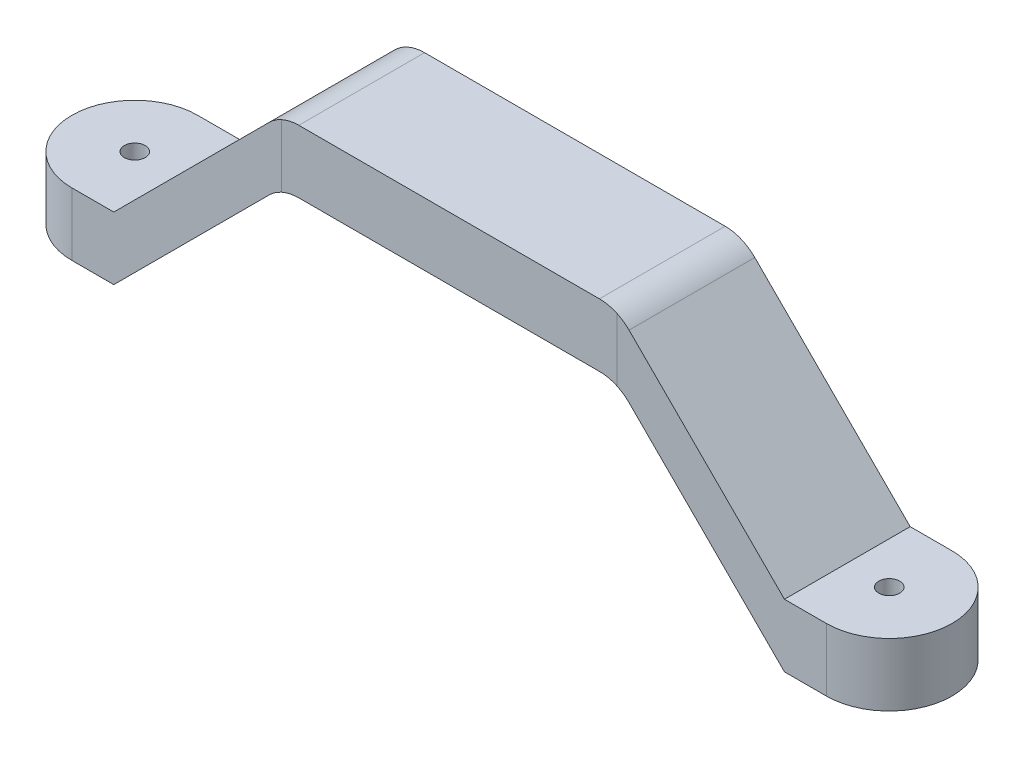
ISO-10303-21;
HEADER;
FILE_DESCRIPTION(('STEP AP214'),'2;1');
FILE_NAME('part.step','',(''),(''),'','','');
FILE_SCHEMA(('AUTOMOTIVE_DESIGN { 1 0 10303 214 1 1 1 1 }'));
ENDSEC;
DATA;
#1=APPLICATION_CONTEXT('core data for automotive mechanical design processes');
#2=APPLICATION_PROTOCOL_DEFINITION('international standard','automotive_design',2000,#1);
#3=PRODUCT_CONTEXT('',#1,'mechanical');
#4=PRODUCT('Part','Part','',(#3));
#5=PRODUCT_RELATED_PRODUCT_CATEGORY('part','',(#4));
#6=PRODUCT_DEFINITION_FORMATION('','',#4);
#7=PRODUCT_DEFINITION_CONTEXT('part definition',#1,'design');
#8=PRODUCT_DEFINITION('design','',#6,#7);
#9=PRODUCT_DEFINITION_SHAPE('','',#8);
#10=(LENGTH_UNIT() NAMED_UNIT(*) SI_UNIT(.MILLI.,.METRE.));
#11=(NAMED_UNIT(*) PLANE_ANGLE_UNIT() SI_UNIT($,.RADIAN.));
#12=(NAMED_UNIT(*) SI_UNIT($,.STERADIAN.) SOLID_ANGLE_UNIT());
#13=UNCERTAINTY_MEASURE_WITH_UNIT(LENGTH_MEASURE(1.E-05),#10,'distance_accuracy_value','');
#14=(GEOMETRIC_REPRESENTATION_CONTEXT(3) GLOBAL_UNCERTAINTY_ASSIGNED_CONTEXT((#13)) GLOBAL_UNIT_ASSIGNED_CONTEXT((#10,
#11,#12)) REPRESENTATION_CONTEXT('',''));
#15=CARTESIAN_POINT('',(0.,0.,0.));
#16=DIRECTION('',(0.,0.,1.));
#17=DIRECTION('',(1.,0.,0.));
#18=AXIS2_PLACEMENT_3D('',#15,#16,#17);
#19=CARTESIAN_POINT('',(50.8,41.275,-19.05));
#20=DIRECTION('',(0.,0.,-1.));
#21=DIRECTION('',(-1.,0.,0.));
#22=AXIS2_PLACEMENT_3D('',#19,#20,#21);
#23=PLANE('',#22);
#24=DIRECTION('',(1.,0.,0.));
#25=VECTOR('',#24,1.);
#26=CARTESIAN_POINT('',(50.8,60.325,-19.05));
#27=LINE('',#26,#25);
#28=CARTESIAN_POINT('',(56.0605122421383,60.325,-19.05));
#29=VERTEX_POINT('',#28);
#30=CARTESIAN_POINT('',(147.139487757862,60.325,-19.05));
#31=VERTEX_POINT('',#30);
#32=EDGE_CURVE('E300',#29,#31,#27,.T.);
#33=ORIENTED_EDGE('',*,*,#32,.T.);
#34=CARTESIAN_POINT('',(147.139487757862,47.625,-19.05));
#35=DIRECTION('',(0.,0.,-1.));
#36=DIRECTION('',(-1.,0.,0.));
#37=AXIS2_PLACEMENT_3D('',#34,#35,#36);
#38=CIRCLE('',#37,12.7);
#39=CARTESIAN_POINT('',(152.4,59.1842824582806,-19.05));
#40=VERTEX_POINT('',#39);
#41=EDGE_CURVE('E335',#31,#40,#38,.T.);
#42=ORIENTED_EDGE('',*,*,#41,.T.);
#43=DIRECTION('',(0.,1.,0.));
#44=VECTOR('',#43,1.);
#45=CARTESIAN_POINT('',(152.4,41.275,-19.05));
#46=LINE('',#45,#44);
#47=CARTESIAN_POINT('',(152.4,40.1342824582806,-19.05));
#48=VERTEX_POINT('',#47);
#49=EDGE_CURVE('E214',#48,#40,#46,.T.);
#50=ORIENTED_EDGE('',*,*,#49,.F.);
#51=CARTESIAN_POINT('',(147.139487757862,28.575,-19.05));
#52=DIRECTION('',(0.,0.,-1.));
#53=DIRECTION('',(-1.,0.,0.));
#54=AXIS2_PLACEMENT_3D('',#51,#52,#53);
#55=CIRCLE('',#54,12.7);
#56=CARTESIAN_POINT('',(147.139487757862,41.275,-19.05));
#57=VERTEX_POINT('',#56);
#58=EDGE_CURVE('E367',#48,#57,#55,.F.);
#59=ORIENTED_EDGE('',*,*,#58,.T.);
#60=DIRECTION('',(1.,0.,0.));
#61=VECTOR('',#60,1.);
#62=CARTESIAN_POINT('',(50.8,41.275,-19.05));
#63=LINE('',#62,#61);
#64=CARTESIAN_POINT('',(56.0605122421383,41.275,-19.05));
#65=VERTEX_POINT('',#64);
#66=EDGE_CURVE('E269',#65,#57,#63,.T.);
#67=ORIENTED_EDGE('',*,*,#66,.F.);
#68=CARTESIAN_POINT('',(56.0605122421383,28.575,-19.05));
#69=DIRECTION('',(0.,0.,-1.));
#70=DIRECTION('',(-1.,0.,0.));
#71=AXIS2_PLACEMENT_3D('',#68,#69,#70);
#72=CIRCLE('',#71,12.7);
#73=CARTESIAN_POINT('',(50.8,40.1342824582806,-19.05));
#74=VERTEX_POINT('',#73);
#75=EDGE_CURVE('E377',#65,#74,#72,.F.);
#76=ORIENTED_EDGE('',*,*,#75,.T.);
#77=DIRECTION('',(0.,1.,0.));
#78=VECTOR('',#77,1.);
#79=CARTESIAN_POINT('',(50.8,41.275,-19.05));
#80=LINE('',#79,#78);
#81=CARTESIAN_POINT('',(50.8,59.1842824582805,-19.05));
#82=VERTEX_POINT('',#81);
#83=EDGE_CURVE('E68',#74,#82,#80,.T.);
#84=ORIENTED_EDGE('',*,*,#83,.T.);
#85=CARTESIAN_POINT('',(56.0605122421383,47.625,-19.05));
#86=DIRECTION('',(0.,0.,-1.));
#87=DIRECTION('',(-1.,0.,0.));
#88=AXIS2_PLACEMENT_3D('',#85,#86,#87);
#89=CIRCLE('',#88,12.7);
#90=EDGE_CURVE('E332',#82,#29,#89,.T.);
#91=ORIENTED_EDGE('',*,*,#90,.T.);
#92=EDGE_LOOP('',(#33,#42,#50,#59,#67,#76,#84,#91));
#93=FACE_BOUND('',#92,.T.);
#94=ADVANCED_FACE('F45',(#93),#23,.T.);
#95=CARTESIAN_POINT('',(50.8,60.325,19.05));
#96=DIRECTION('',(0.,1.,0.));
#97=DIRECTION('',(-1.,0.,0.));
#98=AXIS2_PLACEMENT_3D('',#95,#96,#97);
#99=PLANE('',#98);
#100=DIRECTION('',(1.,0.,0.));
#101=VECTOR('',#100,1.);
#102=CARTESIAN_POINT('',(50.8,60.325,19.05));
#103=LINE('',#102,#101);
#104=CARTESIAN_POINT('',(56.0605122421383,60.325,19.05));
#105=VERTEX_POINT('',#104);
#106=CARTESIAN_POINT('',(147.139487757862,60.325,19.05));
#107=VERTEX_POINT('',#106);
#108=EDGE_CURVE('E304',#105,#107,#103,.T.);
#109=ORIENTED_EDGE('',*,*,#108,.T.);
#110=DIRECTION('',(0.,0.,1.));
#111=VECTOR('',#110,1.);
#112=CARTESIAN_POINT('',(147.139487757862,60.325,19.05));
#113=LINE('',#112,#111);
#114=EDGE_CURVE('E329',#107,#31,#113,.F.);
#115=ORIENTED_EDGE('',*,*,#114,.T.);
#116=ORIENTED_EDGE('',*,*,#32,.F.);
#117=DIRECTION('',(0.,0.,1.));
#118=VECTOR('',#117,1.);
#119=CARTESIAN_POINT('',(56.0605122421383,60.325,19.05));
#120=LINE('',#119,#118);
#121=EDGE_CURVE('E325',#29,#105,#120,.T.);
#122=ORIENTED_EDGE('',*,*,#121,.T.);
#123=EDGE_LOOP('',(#109,#115,#116,#122));
#124=FACE_BOUND('',#123,.T.);
#125=ADVANCED_FACE('F414',(#124),#99,.T.);
#126=CARTESIAN_POINT('',(50.8,41.275,19.05));
#127=DIRECTION('',(0.,0.,1.));
#128=DIRECTION('',(1.,0.,0.));
#129=AXIS2_PLACEMENT_3D('',#126,#127,#128);
#130=PLANE('',#129);
#131=DIRECTION('',(0.,-1.,0.));
#132=VECTOR('',#131,1.);
#133=CARTESIAN_POINT('',(152.4,41.275,19.05));
#134=LINE('',#133,#132);
#135=CARTESIAN_POINT('',(152.4,59.1842824582806,19.05));
#136=VERTEX_POINT('',#135);
#137=CARTESIAN_POINT('',(152.4,40.1342824582806,19.05));
#138=VERTEX_POINT('',#137);
#139=EDGE_CURVE('E218',#136,#138,#134,.T.);
#140=ORIENTED_EDGE('',*,*,#139,.F.);
#141=CARTESIAN_POINT('',(147.139487757862,47.625,19.05));
#142=DIRECTION('',(0.,0.,1.));
#143=DIRECTION('',(1.,0.,0.));
#144=AXIS2_PLACEMENT_3D('',#141,#142,#143);
#145=CIRCLE('',#144,12.7);
#146=EDGE_CURVE('E322',#136,#107,#145,.T.);
#147=ORIENTED_EDGE('',*,*,#146,.T.);
#148=ORIENTED_EDGE('',*,*,#108,.F.);
#149=CARTESIAN_POINT('',(56.0605122421383,47.625,19.05));
#150=DIRECTION('',(0.,0.,1.));
#151=DIRECTION('',(1.,0.,0.));
#152=AXIS2_PLACEMENT_3D('',#149,#150,#151);
#153=CIRCLE('',#152,12.7);
#154=CARTESIAN_POINT('',(50.8,59.1842824582805,19.05));
#155=VERTEX_POINT('',#154);
#156=EDGE_CURVE('E319',#105,#155,#153,.T.);
#157=ORIENTED_EDGE('',*,*,#156,.T.);
#158=DIRECTION('',(0.,-1.,0.));
#159=VECTOR('',#158,1.);
#160=CARTESIAN_POINT('',(50.8,41.275,19.05));
#161=LINE('',#160,#159);
#162=CARTESIAN_POINT('',(50.8,40.1342824582806,19.05));
#163=VERTEX_POINT('',#162);
#164=EDGE_CURVE('E60',#155,#163,#161,.T.);
#165=ORIENTED_EDGE('',*,*,#164,.T.);
#166=CARTESIAN_POINT('',(56.0605122421383,28.575,19.05));
#167=DIRECTION('',(0.,0.,1.));
#168=DIRECTION('',(1.,0.,0.));
#169=AXIS2_PLACEMENT_3D('',#166,#167,#168);
#170=CIRCLE('',#169,12.7);
#171=CARTESIAN_POINT('',(56.0605122421383,41.275,19.05));
#172=VERTEX_POINT('',#171);
#173=EDGE_CURVE('E11',#163,#172,#170,.F.);
#174=ORIENTED_EDGE('',*,*,#173,.T.);
#175=DIRECTION('',(1.,0.,0.));
#176=VECTOR('',#175,1.);
#177=CARTESIAN_POINT('',(50.8,41.275,19.05));
#178=LINE('',#177,#176);
#179=CARTESIAN_POINT('',(147.139487757862,41.275,19.05));
#180=VERTEX_POINT('',#179);
#181=EDGE_CURVE('E286',#172,#180,#178,.T.);
#182=ORIENTED_EDGE('',*,*,#181,.T.);
#183=CARTESIAN_POINT('',(147.139487757862,28.575,19.05));
#184=DIRECTION('',(0.,0.,1.));
#185=DIRECTION('',(1.,0.,0.));
#186=AXIS2_PLACEMENT_3D('',#183,#184,#185);
#187=CIRCLE('',#186,12.7);
#188=EDGE_CURVE('E370',#180,#138,#187,.F.);
#189=ORIENTED_EDGE('',*,*,#188,.T.);
#190=EDGE_LOOP('',(#140,#147,#148,#157,#165,#174,#182,#189));
#191=FACE_BOUND('',#190,.T.);
#192=ADVANCED_FACE('F394',(#191),#130,.T.);
#193=CARTESIAN_POINT('',(50.8,41.275,19.05));
#194=DIRECTION('',(0.,-1.,0.));
#195=DIRECTION('',(1.,0.,0.));
#196=AXIS2_PLACEMENT_3D('',#193,#194,#195);
#197=PLANE('',#196);
#198=ORIENTED_EDGE('',*,*,#66,.T.);
#199=DIRECTION('',(0.,0.,-1.));
#200=VECTOR('',#199,1.);
#201=CARTESIAN_POINT('',(147.139487757862,41.275,19.05));
#202=LINE('',#201,#200);
#203=EDGE_CURVE('E357',#57,#180,#202,.F.);
#204=ORIENTED_EDGE('',*,*,#203,.T.);
#205=ORIENTED_EDGE('',*,*,#181,.F.);
#206=DIRECTION('',(0.,0.,-1.));
#207=VECTOR('',#206,1.);
#208=CARTESIAN_POINT('',(56.0605122421383,41.275,-19.05));
#209=LINE('',#208,#207);
#210=EDGE_CURVE('E353',#172,#65,#209,.T.);
#211=ORIENTED_EDGE('',*,*,#210,.T.);
#212=EDGE_LOOP('',(#198,#204,#205,#211));
#213=FACE_BOUND('',#212,.T.);
#214=ADVANCED_FACE('F397',(#213),#197,.T.);
#215=CARTESIAN_POINT('',(0.,-9.525,-19.05));
#216=DIRECTION('',(0.,0.,-1.));
#217=DIRECTION('',(-1.,0.,0.));
#218=AXIS2_PLACEMENT_3D('',#215,#216,#217);
#219=PLANE('',#218);
#220=DIRECTION('',(0.707106781186547,0.707106781186547,0.));
#221=VECTOR('',#220,1.);
#222=CARTESIAN_POINT('',(0.,9.525,-19.05));
#223=LINE('',#222,#221);
#224=CARTESIAN_POINT('',(0.,9.525,-19.05));
#225=VERTEX_POINT('',#224);
#226=CARTESIAN_POINT('',(47.0802561210691,56.6052561210691,-19.05));
#227=VERTEX_POINT('',#226);
#228=EDGE_CURVE('E272',#225,#227,#223,.T.);
#229=ORIENTED_EDGE('',*,*,#228,.T.);
#230=CARTESIAN_POINT('',(56.0605122421383,47.625,-19.05));
#231=DIRECTION('',(0.,0.,-1.));
#232=DIRECTION('',(-1.,0.,0.));
#233=AXIS2_PLACEMENT_3D('',#230,#231,#232);
#234=CIRCLE('',#233,12.7);
#235=EDGE_CURVE('E346',#227,#82,#234,.T.);
#236=ORIENTED_EDGE('',*,*,#235,.T.);
#237=ORIENTED_EDGE('',*,*,#83,.F.);
#238=CARTESIAN_POINT('',(56.0605122421383,28.575,-19.05));
#239=DIRECTION('',(0.,0.,-1.));
#240=DIRECTION('',(-1.,0.,0.));
#241=AXIS2_PLACEMENT_3D('',#238,#239,#240);
#242=CIRCLE('',#241,12.7);
#243=CARTESIAN_POINT('',(47.0802561210691,37.5552561210691,-19.05));
#244=VERTEX_POINT('',#243);
#245=EDGE_CURVE('E380',#74,#244,#242,.F.);
#246=ORIENTED_EDGE('',*,*,#245,.T.);
#247=DIRECTION('',(0.707106781186547,0.707106781186547,0.));
#248=VECTOR('',#247,1.);
#249=CARTESIAN_POINT('',(0.,-9.525,-19.05));
#250=LINE('',#249,#248);
#251=CARTESIAN_POINT('',(0.,-9.525,-19.05));
#252=VERTEX_POINT('',#251);
#253=EDGE_CURVE('E273',#252,#244,#250,.T.);
#254=ORIENTED_EDGE('',*,*,#253,.F.);
#255=DIRECTION('',(-1.,0.,0.));
#256=VECTOR('',#255,1.);
#257=CARTESIAN_POINT('',(0.,-9.525,-19.05));
#258=LINE('',#257,#256);
#259=CARTESIAN_POINT('',(-12.7,-9.525,-19.05));
#260=VERTEX_POINT('',#259);
#261=EDGE_CURVE('E240',#252,#260,#258,.T.);
#262=ORIENTED_EDGE('',*,*,#261,.T.);
#263=DIRECTION('',(0.,-1.,0.));
#264=VECTOR('',#263,1.);
#265=CARTESIAN_POINT('',(-12.7,9.525,-19.05));
#266=LINE('',#265,#264);
#267=CARTESIAN_POINT('',(-12.7,9.525,-19.05));
#268=VERTEX_POINT('',#267);
#269=EDGE_CURVE('E265',#268,#260,#266,.T.);
#270=ORIENTED_EDGE('',*,*,#269,.F.);
#271=DIRECTION('',(-1.,0.,0.));
#272=VECTOR('',#271,1.);
#273=CARTESIAN_POINT('',(0.,9.525,-19.05));
#274=LINE('',#273,#272);
#275=EDGE_CURVE('E244',#225,#268,#274,.T.);
#276=ORIENTED_EDGE('',*,*,#275,.F.);
#277=EDGE_LOOP('',(#229,#236,#237,#246,#254,#262,#270,#276));
#278=FACE_BOUND('',#277,.T.);
#279=ADVANCED_FACE('F445',(#278),#219,.T.);
#280=CARTESIAN_POINT('',(0.,9.525,19.05));
#281=DIRECTION('',(-0.707106781186548,0.707106781186547,0.));
#282=DIRECTION('',(-0.707106781186547,-0.707106781186548,0.));
#283=AXIS2_PLACEMENT_3D('',#280,#281,#282);
#284=PLANE('',#283);
#285=DIRECTION('',(0.707106781186547,0.707106781186547,0.));
#286=VECTOR('',#285,1.);
#287=CARTESIAN_POINT('',(0.,9.525,19.05));
#288=LINE('',#287,#286);
#289=CARTESIAN_POINT('',(0.,9.525,19.05));
#290=VERTEX_POINT('',#289);
#291=CARTESIAN_POINT('',(47.0802561210691,56.6052561210691,19.05));
#292=VERTEX_POINT('',#291);
#293=EDGE_CURVE('E277',#290,#292,#288,.T.);
#294=ORIENTED_EDGE('',*,*,#293,.T.);
#295=DIRECTION('',(0.,0.,1.));
#296=VECTOR('',#295,1.);
#297=CARTESIAN_POINT('',(47.0802561210691,56.6052561210691,19.05));
#298=LINE('',#297,#296);
#299=EDGE_CURVE('E343',#292,#227,#298,.F.);
#300=ORIENTED_EDGE('',*,*,#299,.T.);
#301=ORIENTED_EDGE('',*,*,#228,.F.);
#302=DIRECTION('',(0.,0.,1.));
#303=VECTOR('',#302,1.);
#304=CARTESIAN_POINT('',(0.,9.525,19.05));
#305=LINE('',#304,#303);
#306=EDGE_CURVE('E282',#225,#290,#305,.T.);
#307=ORIENTED_EDGE('',*,*,#306,.T.);
#308=EDGE_LOOP('',(#294,#300,#301,#307));
#309=FACE_BOUND('',#308,.T.);
#310=ADVANCED_FACE('F425',(#309),#284,.T.);
#311=CARTESIAN_POINT('',(0.,-9.525,19.05));
#312=DIRECTION('',(0.,0.,1.));
#313=DIRECTION('',(1.,0.,0.));
#314=AXIS2_PLACEMENT_3D('',#311,#312,#313);
#315=PLANE('',#314);
#316=ORIENTED_EDGE('',*,*,#164,.F.);
#317=CARTESIAN_POINT('',(56.0605122421383,47.625,19.05));
#318=DIRECTION('',(0.,0.,1.));
#319=DIRECTION('',(1.,0.,0.));
#320=AXIS2_PLACEMENT_3D('',#317,#318,#319);
#321=CIRCLE('',#320,12.7);
#322=EDGE_CURVE('E340',#155,#292,#321,.T.);
#323=ORIENTED_EDGE('',*,*,#322,.T.);
#324=ORIENTED_EDGE('',*,*,#293,.F.);
#325=DIRECTION('',(1.,0.,0.));
#326=VECTOR('',#325,1.);
#327=CARTESIAN_POINT('',(0.,9.525,19.05));
#328=LINE('',#327,#326);
#329=CARTESIAN_POINT('',(-12.7,9.525,19.05));
#330=VERTEX_POINT('',#329);
#331=EDGE_CURVE('E251',#330,#290,#328,.T.);
#332=ORIENTED_EDGE('',*,*,#331,.F.);
#333=DIRECTION('',(0.,-1.,0.));
#334=VECTOR('',#333,1.);
#335=CARTESIAN_POINT('',(-12.7,9.525,19.05));
#336=LINE('',#335,#334);
#337=CARTESIAN_POINT('',(-12.7,-9.525,19.05));
#338=VERTEX_POINT('',#337);
#339=EDGE_CURVE('E254',#330,#338,#336,.T.);
#340=ORIENTED_EDGE('',*,*,#339,.T.);
#341=DIRECTION('',(1.,0.,0.));
#342=VECTOR('',#341,1.);
#343=CARTESIAN_POINT('',(0.,-9.525,19.05));
#344=LINE('',#343,#342);
#345=CARTESIAN_POINT('',(0.,-9.525,19.05));
#346=VERTEX_POINT('',#345);
#347=EDGE_CURVE('E248',#338,#346,#344,.T.);
#348=ORIENTED_EDGE('',*,*,#347,.T.);
#349=DIRECTION('',(0.707106781186547,0.707106781186547,0.));
#350=VECTOR('',#349,1.);
#351=CARTESIAN_POINT('',(0.,-9.525,19.05));
#352=LINE('',#351,#350);
#353=CARTESIAN_POINT('',(47.0802561210691,37.5552561210691,19.05));
#354=VERTEX_POINT('',#353);
#355=EDGE_CURVE('E292',#346,#354,#352,.T.);
#356=ORIENTED_EDGE('',*,*,#355,.T.);
#357=CARTESIAN_POINT('',(56.0605122421383,28.575,19.05));
#358=DIRECTION('',(0.,0.,1.));
#359=DIRECTION('',(1.,0.,0.));
#360=AXIS2_PLACEMENT_3D('',#357,#358,#359);
#361=CIRCLE('',#360,12.7);
#362=EDGE_CURVE('E54',#354,#163,#361,.F.);
#363=ORIENTED_EDGE('',*,*,#362,.T.);
#364=EDGE_LOOP('',(#316,#323,#324,#332,#340,#348,#356,#363));
#365=FACE_BOUND('',#364,.T.);
#366=ADVANCED_FACE('F386',(#365),#315,.T.);
#367=CARTESIAN_POINT('',(0.,-9.525,19.05));
#368=DIRECTION('',(0.707106781186548,-0.707106781186547,0.));
#369=DIRECTION('',(0.707106781186547,0.707106781186548,0.));
#370=AXIS2_PLACEMENT_3D('',#367,#368,#369);
#371=PLANE('',#370);
#372=ORIENTED_EDGE('',*,*,#253,.T.);
#373=DIRECTION('',(0.,0.,-1.));
#374=VECTOR('',#373,1.);
#375=CARTESIAN_POINT('',(47.0802561210691,37.5552561210691,19.05));
#376=LINE('',#375,#374);
#377=EDGE_CURVE('E360',#244,#354,#376,.F.);
#378=ORIENTED_EDGE('',*,*,#377,.T.);
#379=ORIENTED_EDGE('',*,*,#355,.F.);
#380=DIRECTION('',(0.,0.,-1.));
#381=VECTOR('',#380,1.);
#382=CARTESIAN_POINT('',(0.,-9.525,19.05));
#383=LINE('',#382,#381);
#384=EDGE_CURVE('E281',#346,#252,#383,.T.);
#385=ORIENTED_EDGE('',*,*,#384,.T.);
#386=EDGE_LOOP('',(#372,#378,#379,#385));
#387=FACE_BOUND('',#386,.T.);
#388=ADVANCED_FACE('F443',(#387),#371,.T.);
#389=CARTESIAN_POINT('',(-12.7,9.525,0.));
#390=DIRECTION('',(0.,1.,0.));
#391=DIRECTION('',(0.,0.,1.));
#392=AXIS2_PLACEMENT_3D('',#389,#390,#391);
#393=PLANE('',#392);
#394=ORIENTED_EDGE('',*,*,#306,.F.);
#395=ORIENTED_EDGE('',*,*,#275,.T.);
#396=CARTESIAN_POINT('',(-12.7,9.525,0.));
#397=DIRECTION('',(0.,1.,0.));
#398=DIRECTION('',(0.,0.,1.));
#399=AXIS2_PLACEMENT_3D('',#396,#397,#398);
#400=CIRCLE('',#399,19.05);
#401=EDGE_CURVE('E247',#268,#330,#400,.T.);
#402=ORIENTED_EDGE('',*,*,#401,.T.);
#403=ORIENTED_EDGE('',*,*,#331,.T.);
#404=EDGE_LOOP('',(#394,#395,#402,#403));
#405=FACE_BOUND('',#404,.T.);
#406=CARTESIAN_POINT('',(-12.7,9.525,0.));
#407=DIRECTION('',(0.,1.,0.));
#408=DIRECTION('',(0.,0.,1.));
#409=AXIS2_PLACEMENT_3D('',#406,#407,#408);
#410=CIRCLE('',#409,3.175);
#411=CARTESIAN_POINT('',(-12.7,9.525,-3.175));
#412=VERTEX_POINT('',#411);
#413=EDGE_CURVE('E236',#412,#412,#410,.T.);
#414=ORIENTED_EDGE('',*,*,#413,.F.);
#415=EDGE_LOOP('',(#414));
#416=FACE_BOUND('',#415,.T.);
#417=ADVANCED_FACE('F429',(#405,#416),#393,.T.);
#418=CARTESIAN_POINT('',(-12.7,-9.525,0.));
#419=DIRECTION('',(0.,1.,0.));
#420=DIRECTION('',(0.,0.,1.));
#421=AXIS2_PLACEMENT_3D('',#418,#419,#420);
#422=PLANE('',#421);
#423=ORIENTED_EDGE('',*,*,#384,.F.);
#424=ORIENTED_EDGE('',*,*,#347,.F.);
#425=CARTESIAN_POINT('',(-12.7,-9.525,0.));
#426=DIRECTION('',(0.,1.,0.));
#427=DIRECTION('',(0.,0.,1.));
#428=AXIS2_PLACEMENT_3D('',#425,#426,#427);
#429=CIRCLE('',#428,19.05);
#430=EDGE_CURVE('E257',#260,#338,#429,.T.);
#431=ORIENTED_EDGE('',*,*,#430,.F.);
#432=ORIENTED_EDGE('',*,*,#261,.F.);
#433=EDGE_LOOP('',(#423,#424,#431,#432));
#434=FACE_BOUND('',#433,.T.);
#435=CARTESIAN_POINT('',(-12.7,-9.525,0.));
#436=DIRECTION('',(0.,1.,0.));
#437=DIRECTION('',(0.,0.,1.));
#438=AXIS2_PLACEMENT_3D('',#435,#436,#437);
#439=CIRCLE('',#438,3.175);
#440=CARTESIAN_POINT('',(-12.7,-9.525,-3.175));
#441=VERTEX_POINT('',#440);
#442=EDGE_CURVE('E233',#441,#441,#439,.T.);
#443=ORIENTED_EDGE('',*,*,#442,.T.);
#444=EDGE_LOOP('',(#443));
#445=FACE_BOUND('',#444,.T.);
#446=ADVANCED_FACE('F439',(#434,#445),#422,.F.);
#447=CARTESIAN_POINT('',(-12.7,9.525,0.));
#448=DIRECTION('',(0.,-1.,0.));
#449=DIRECTION('',(0.,0.,-1.));
#450=AXIS2_PLACEMENT_3D('',#447,#448,#449);
#451=CYLINDRICAL_SURFACE('',#450,19.05);
#452=ORIENTED_EDGE('',*,*,#430,.T.);
#453=ORIENTED_EDGE('',*,*,#339,.F.);
#454=ORIENTED_EDGE('',*,*,#401,.F.);
#455=ORIENTED_EDGE('',*,*,#269,.T.);
#456=EDGE_LOOP('',(#452,#453,#454,#455));
#457=FACE_BOUND('',#456,.T.);
#458=ADVANCED_FACE('F446',(#457),#451,.T.);
#459=CARTESIAN_POINT('',(-12.7,9.525,0.));
#460=DIRECTION('',(0.,-1.,0.));
#461=DIRECTION('',(0.,0.,-1.));
#462=AXIS2_PLACEMENT_3D('',#459,#460,#461);
#463=CYLINDRICAL_SURFACE('',#462,3.175);
#464=CARTESIAN_POINT('',(-12.7,9.525,-3.175));
#465=CARTESIAN_POINT('',(-12.7,9.3265625,-3.175));
#466=CARTESIAN_POINT('',(-12.7,9.128125,-3.175));
#467=CARTESIAN_POINT('',(-12.7,8.73125,-3.175));
#468=CARTESIAN_POINT('',(-12.7,8.5328125,-3.175));
#469=CARTESIAN_POINT('',(-12.7,8.1359375,-3.175));
#470=CARTESIAN_POINT('',(-12.7,7.9375,-3.175));
#471=CARTESIAN_POINT('',(-12.7,7.540625,-3.175));
#472=CARTESIAN_POINT('',(-12.7,7.3421875,-3.175));
#473=CARTESIAN_POINT('',(-12.7,6.9453125,-3.175));
#474=CARTESIAN_POINT('',(-12.7,6.746875,-3.175));
#475=CARTESIAN_POINT('',(-12.7,6.35,-3.175));
#476=CARTESIAN_POINT('',(-12.7,6.1515625,-3.175));
#477=CARTESIAN_POINT('',(-12.7,5.7546875,-3.175));
#478=CARTESIAN_POINT('',(-12.7,5.55625,-3.175));
#479=CARTESIAN_POINT('',(-12.7,5.159375,-3.175));
#480=CARTESIAN_POINT('',(-12.7,4.9609375,-3.175));
#481=CARTESIAN_POINT('',(-12.7,4.5640625,-3.175));
#482=CARTESIAN_POINT('',(-12.7,4.365625,-3.175));
#483=CARTESIAN_POINT('',(-12.7,3.96875,-3.175));
#484=CARTESIAN_POINT('',(-12.7,3.7703125,-3.175));
#485=CARTESIAN_POINT('',(-12.7,3.3734375,-3.175));
#486=CARTESIAN_POINT('',(-12.7,3.175,-3.175));
#487=CARTESIAN_POINT('',(-12.7,2.778125,-3.175));
#488=CARTESIAN_POINT('',(-12.7,2.5796875,-3.175));
#489=CARTESIAN_POINT('',(-12.7,2.1828125,-3.175));
#490=CARTESIAN_POINT('',(-12.7,1.984375,-3.175));
#491=CARTESIAN_POINT('',(-12.7,1.5875,-3.175));
#492=CARTESIAN_POINT('',(-12.7,1.3890625,-3.175));
#493=CARTESIAN_POINT('',(-12.7,0.992187499999997,-3.175));
#494=CARTESIAN_POINT('',(-12.7,0.793749999999997,-3.175));
#495=CARTESIAN_POINT('',(-12.7,0.396874999999997,-3.175));
#496=CARTESIAN_POINT('',(-12.7,0.198437499999997,-3.175));
#497=CARTESIAN_POINT('',(-12.7,-0.198437500000004,-3.175));
#498=CARTESIAN_POINT('',(-12.7,-0.396875000000004,-3.175));
#499=CARTESIAN_POINT('',(-12.7,-0.793750000000004,-3.175));
#500=CARTESIAN_POINT('',(-12.7,-0.992187500000004,-3.175));
#501=CARTESIAN_POINT('',(-12.7,-1.3890625,-3.175));
#502=CARTESIAN_POINT('',(-12.7,-1.5875,-3.175));
#503=CARTESIAN_POINT('',(-12.7,-1.984375,-3.175));
#504=CARTESIAN_POINT('',(-12.7,-2.1828125,-3.175));
#505=CARTESIAN_POINT('',(-12.7,-2.5796875,-3.175));
#506=CARTESIAN_POINT('',(-12.7,-2.778125,-3.175));
#507=CARTESIAN_POINT('',(-12.7,-3.175,-3.175));
#508=CARTESIAN_POINT('',(-12.7,-3.3734375,-3.175));
#509=CARTESIAN_POINT('',(-12.7,-3.7703125,-3.175));
#510=CARTESIAN_POINT('',(-12.7,-3.96875,-3.175));
#511=CARTESIAN_POINT('',(-12.7,-4.365625,-3.175));
#512=CARTESIAN_POINT('',(-12.7,-4.5640625,-3.175));
#513=CARTESIAN_POINT('',(-12.7,-4.9609375,-3.175));
#514=CARTESIAN_POINT('',(-12.7,-5.15937500000001,-3.175));
#515=CARTESIAN_POINT('',(-12.7,-5.55625,-3.175));
#516=CARTESIAN_POINT('',(-12.7,-5.75468750000001,-3.175));
#517=CARTESIAN_POINT('',(-12.7,-6.1515625,-3.175));
#518=CARTESIAN_POINT('',(-12.7,-6.35,-3.175));
#519=CARTESIAN_POINT('',(-12.7,-6.746875,-3.175));
#520=CARTESIAN_POINT('',(-12.7,-6.9453125,-3.175));
#521=CARTESIAN_POINT('',(-12.7,-7.3421875,-3.175));
#522=CARTESIAN_POINT('',(-12.7,-7.540625,-3.175));
#523=CARTESIAN_POINT('',(-12.7,-7.9375,-3.175));
#524=CARTESIAN_POINT('',(-12.7,-8.1359375,-3.175));
#525=CARTESIAN_POINT('',(-12.7,-8.5328125,-3.175));
#526=CARTESIAN_POINT('',(-12.7,-8.73125,-3.175));
#527=CARTESIAN_POINT('',(-12.7,-9.128125,-3.175));
#528=CARTESIAN_POINT('',(-12.7,-9.3265625,-3.175));
#529=CARTESIAN_POINT('',(-12.7,-9.525,-3.175));
#530=B_SPLINE_CURVE_WITH_KNOTS('',3,(#464,#465,#466,#467,#468,#469,#470,#471,#472,#473,#474,
#475,#476,#477,#478,#479,#480,#481,#482,#483,#484,#485,#486,#487,#488,#489,#490,#491,#492,#493,
#494,#495,#496,#497,#498,#499,#500,#501,#502,#503,#504,#505,#506,#507,#508,#509,#510,#511,#512,
#513,#514,#515,#516,#517,#518,#519,#520,#521,#522,#523,#524,#525,#526,#527,#528,#529),
.UNSPECIFIED.,.F.,.F.,(4,2,2,2,2,2,2,2,2,2,2,2,2,2,2,2,2,2,2,2,2,2,2,2,2,2,2,2,2,2,2,2,4),(0.,
0.595312499999999,1.190625,1.7859375,2.38125,2.9765625,3.571875,4.1671875,4.7625,5.3578125,
5.953125,6.5484375,7.14375,7.7390625,8.334375,8.9296875,9.525,10.1203125,10.715625,11.3109375,
11.90625,12.5015625,13.096875,13.6921875,14.2875,14.8828125,15.478125,16.0734375,16.66875,
17.2640625,17.859375,18.4546875,19.05),.UNSPECIFIED.);
#531=EDGE_CURVE('BSEAM448',#412,#441,#530,.T.);
#532=ORIENTED_EDGE('',*,*,#413,.T.);
#533=ORIENTED_EDGE('',*,*,#442,.F.);
#534=ORIENTED_EDGE('',*,*,#531,.T.);
#535=ORIENTED_EDGE('',*,*,#531,.F.);
#536=EDGE_LOOP('',(#532,#534,#533,#535));
#537=FACE_BOUND('',#536,.T.);
#538=ADVANCED_FACE('F448',(#537),#463,.F.);
#539=CARTESIAN_POINT('',(203.2,-9.525,-19.05));
#540=DIRECTION('',(0.,0.,-1.));
#541=DIRECTION('',(1.,0.,0.));
#542=AXIS2_PLACEMENT_3D('',#539,#540,#541);
#543=PLANE('',#542);
#544=ORIENTED_EDGE('',*,*,#49,.T.);
#545=CARTESIAN_POINT('',(147.139487757862,47.625,-19.05));
#546=DIRECTION('',(0.,0.,-1.));
#547=DIRECTION('',(-1.,0.,0.));
#548=AXIS2_PLACEMENT_3D('',#545,#546,#547);
#549=CIRCLE('',#548,12.7);
#550=CARTESIAN_POINT('',(156.119743878931,56.6052561210691,-19.05));
#551=VERTEX_POINT('',#550);
#552=EDGE_CURVE('E212',#40,#551,#549,.T.);
#553=ORIENTED_EDGE('',*,*,#552,.T.);
#554=DIRECTION('',(-0.707106781186547,0.707106781186547,0.));
#555=VECTOR('',#554,1.);
#556=CARTESIAN_POINT('',(203.2,9.525,-19.05));
#557=LINE('',#556,#555);
#558=CARTESIAN_POINT('',(203.2,9.525,-19.05));
#559=VERTEX_POINT('',#558);
#560=EDGE_CURVE('E188',#559,#551,#557,.T.);
#561=ORIENTED_EDGE('',*,*,#560,.F.);
#562=DIRECTION('',(1.,0.,0.));
#563=VECTOR('',#562,1.);
#564=CARTESIAN_POINT('',(203.2,9.525,-19.05));
#565=LINE('',#564,#563);
#566=CARTESIAN_POINT('',(215.9,9.525,-19.05));
#567=VERTEX_POINT('',#566);
#568=EDGE_CURVE('E199',#559,#567,#565,.T.);
#569=ORIENTED_EDGE('',*,*,#568,.T.);
#570=DIRECTION('',(0.,-1.,0.));
#571=VECTOR('',#570,1.);
#572=CARTESIAN_POINT('',(215.9,9.525,-19.05));
#573=LINE('',#572,#571);
#574=CARTESIAN_POINT('',(215.9,-9.525,-19.05));
#575=VERTEX_POINT('',#574);
#576=EDGE_CURVE('E196',#567,#575,#573,.T.);
#577=ORIENTED_EDGE('',*,*,#576,.T.);
#578=DIRECTION('',(1.,0.,0.));
#579=VECTOR('',#578,1.);
#580=CARTESIAN_POINT('',(203.2,-9.525,-19.05));
#581=LINE('',#580,#579);
#582=CARTESIAN_POINT('',(203.2,-9.525,-19.05));
#583=VERTEX_POINT('',#582);
#584=EDGE_CURVE('E684',#583,#575,#581,.T.);
#585=ORIENTED_EDGE('',*,*,#584,.F.);
#586=DIRECTION('',(-0.707106781186547,0.707106781186547,0.));
#587=VECTOR('',#586,1.);
#588=CARTESIAN_POINT('',(203.2,-9.525,-19.05));
#589=LINE('',#588,#587);
#590=CARTESIAN_POINT('',(156.119743878931,37.5552561210691,-19.05));
#591=VERTEX_POINT('',#590);
#592=EDGE_CURVE('E220',#583,#591,#589,.T.);
#593=ORIENTED_EDGE('',*,*,#592,.T.);
#594=CARTESIAN_POINT('',(147.139487757862,28.575,-19.05));
#595=DIRECTION('',(0.,0.,-1.));
#596=DIRECTION('',(-1.,0.,0.));
#597=AXIS2_PLACEMENT_3D('',#594,#595,#596);
#598=CIRCLE('',#597,12.7);
#599=EDGE_CURVE('E363',#591,#48,#598,.F.);
#600=ORIENTED_EDGE('',*,*,#599,.T.);
#601=EDGE_LOOP('',(#544,#553,#561,#569,#577,#585,#593,#600));
#602=FACE_BOUND('',#601,.T.);
#603=ADVANCED_FACE('F210',(#602),#543,.T.);
#604=CARTESIAN_POINT('',(203.2,9.525,19.05));
#605=DIRECTION('',(0.707106781186548,0.707106781186547,0.));
#606=DIRECTION('',(0.707106781186547,-0.707106781186548,0.));
#607=AXIS2_PLACEMENT_3D('',#604,#605,#606);
#608=PLANE('',#607);
#609=ORIENTED_EDGE('',*,*,#560,.T.);
#610=DIRECTION('',(0.,0.,1.));
#611=VECTOR('',#610,1.);
#612=CARTESIAN_POINT('',(156.119743878931,56.6052561210691,19.05));
#613=LINE('',#612,#611);
#614=CARTESIAN_POINT('',(156.119743878931,56.6052561210691,19.05));
#615=VERTEX_POINT('',#614);
#616=EDGE_CURVE('E296',#551,#615,#613,.T.);
#617=ORIENTED_EDGE('',*,*,#616,.T.);
#618=DIRECTION('',(-0.707106781186547,0.707106781186547,0.));
#619=VECTOR('',#618,1.);
#620=CARTESIAN_POINT('',(203.2,9.525,19.05));
#621=LINE('',#620,#619);
#622=CARTESIAN_POINT('',(203.2,9.525,19.05));
#623=VERTEX_POINT('',#622);
#624=EDGE_CURVE('E191',#623,#615,#621,.T.);
#625=ORIENTED_EDGE('',*,*,#624,.F.);
#626=DIRECTION('',(0.,0.,1.));
#627=VECTOR('',#626,1.);
#628=CARTESIAN_POINT('',(203.2,9.525,19.05));
#629=LINE('',#628,#627);
#630=EDGE_CURVE('E183',#559,#623,#629,.T.);
#631=ORIENTED_EDGE('',*,*,#630,.F.);
#632=EDGE_LOOP('',(#609,#617,#625,#631));
#633=FACE_BOUND('',#632,.T.);
#634=ADVANCED_FACE('F185',(#633),#608,.T.);
#635=CARTESIAN_POINT('',(203.2,-9.525,19.05));
#636=DIRECTION('',(0.,0.,1.));
#637=DIRECTION('',(-1.,0.,0.));
#638=AXIS2_PLACEMENT_3D('',#635,#636,#637);
#639=PLANE('',#638);
#640=ORIENTED_EDGE('',*,*,#624,.T.);
#641=CARTESIAN_POINT('',(147.139487757862,47.625,19.05));
#642=DIRECTION('',(0.,0.,1.));
#643=DIRECTION('',(1.,0.,0.));
#644=AXIS2_PLACEMENT_3D('',#641,#642,#643);
#645=CIRCLE('',#644,12.7);
#646=EDGE_CURVE('E316',#615,#136,#645,.T.);
#647=ORIENTED_EDGE('',*,*,#646,.T.);
#648=ORIENTED_EDGE('',*,*,#139,.T.);
#649=CARTESIAN_POINT('',(147.139487757862,28.575,19.05));
#650=DIRECTION('',(0.,0.,1.));
#651=DIRECTION('',(1.,0.,0.));
#652=AXIS2_PLACEMENT_3D('',#649,#650,#651);
#653=CIRCLE('',#652,12.7);
#654=CARTESIAN_POINT('',(156.119743878931,37.5552561210691,19.05));
#655=VERTEX_POINT('',#654);
#656=EDGE_CURVE('E374',#138,#655,#653,.F.);
#657=ORIENTED_EDGE('',*,*,#656,.T.);
#658=DIRECTION('',(-0.707106781186547,0.707106781186547,0.));
#659=VECTOR('',#658,1.);
#660=CARTESIAN_POINT('',(203.2,-9.525,19.05));
#661=LINE('',#660,#659);
#662=CARTESIAN_POINT('',(203.2,-9.525,19.05));
#663=VERTEX_POINT('',#662);
#664=EDGE_CURVE('E229',#663,#655,#661,.T.);
#665=ORIENTED_EDGE('',*,*,#664,.F.);
#666=DIRECTION('',(-1.,0.,0.));
#667=VECTOR('',#666,1.);
#668=CARTESIAN_POINT('',(203.2,-9.525,19.05));
#669=LINE('',#668,#667);
#670=CARTESIAN_POINT('',(215.9,-9.525,19.05));
#671=VERTEX_POINT('',#670);
#672=EDGE_CURVE('E207',#671,#663,#669,.T.);
#673=ORIENTED_EDGE('',*,*,#672,.F.);
#674=DIRECTION('',(0.,-1.,0.));
#675=VECTOR('',#674,1.);
#676=CARTESIAN_POINT('',(215.9,9.525,19.05));
#677=LINE('',#676,#675);
#678=CARTESIAN_POINT('',(215.9,9.525,19.05));
#679=VERTEX_POINT('',#678);
#680=EDGE_CURVE('E676',#679,#671,#677,.T.);
#681=ORIENTED_EDGE('',*,*,#680,.F.);
#682=DIRECTION('',(-1.,0.,0.));
#683=VECTOR('',#682,1.);
#684=CARTESIAN_POINT('',(203.2,9.525,19.05));
#685=LINE('',#684,#683);
#686=EDGE_CURVE('E673',#679,#623,#685,.T.);
#687=ORIENTED_EDGE('',*,*,#686,.T.);
#688=EDGE_LOOP('',(#640,#647,#648,#657,#665,#673,#681,#687));
#689=FACE_BOUND('',#688,.T.);
#690=ADVANCED_FACE('F552',(#689),#639,.T.);
#691=CARTESIAN_POINT('',(203.2,-9.525,19.05));
#692=DIRECTION('',(-0.707106781186548,-0.707106781186547,0.));
#693=DIRECTION('',(-0.707106781186547,0.707106781186548,0.));
#694=AXIS2_PLACEMENT_3D('',#691,#692,#693);
#695=PLANE('',#694);
#696=ORIENTED_EDGE('',*,*,#664,.T.);
#697=DIRECTION('',(0.,0.,-1.));
#698=VECTOR('',#697,1.);
#699=CARTESIAN_POINT('',(156.119743878931,37.5552561210691,-19.05));
#700=LINE('',#699,#698);
#701=EDGE_CURVE('E349',#655,#591,#700,.T.);
#702=ORIENTED_EDGE('',*,*,#701,.T.);
#703=ORIENTED_EDGE('',*,*,#592,.F.);
#704=DIRECTION('',(0.,0.,-1.));
#705=VECTOR('',#704,1.);
#706=CARTESIAN_POINT('',(203.2,-9.525,19.05));
#707=LINE('',#706,#705);
#708=EDGE_CURVE('E195',#663,#583,#707,.T.);
#709=ORIENTED_EDGE('',*,*,#708,.F.);
#710=EDGE_LOOP('',(#696,#702,#703,#709));
#711=FACE_BOUND('',#710,.T.);
#712=ADVANCED_FACE('F543',(#711),#695,.T.);
#713=CARTESIAN_POINT('',(215.9,9.525,0.));
#714=DIRECTION('',(0.,1.,0.));
#715=DIRECTION('',(0.,0.,1.));
#716=AXIS2_PLACEMENT_3D('',#713,#714,#715);
#717=PLANE('',#716);
#718=ORIENTED_EDGE('',*,*,#630,.T.);
#719=ORIENTED_EDGE('',*,*,#686,.F.);
#720=CARTESIAN_POINT('',(215.9,9.525,0.));
#721=DIRECTION('',(0.,-1.,0.));
#722=DIRECTION('',(0.,0.,1.));
#723=AXIS2_PLACEMENT_3D('',#720,#721,#722);
#724=CIRCLE('',#723,19.05);
#725=EDGE_CURVE('E202',#567,#679,#724,.T.);
#726=ORIENTED_EDGE('',*,*,#725,.F.);
#727=ORIENTED_EDGE('',*,*,#568,.F.);
#728=EDGE_LOOP('',(#718,#719,#726,#727));
#729=FACE_BOUND('',#728,.T.);
#730=CARTESIAN_POINT('',(215.9,9.525,0.));
#731=DIRECTION('',(0.,-1.,0.));
#732=DIRECTION('',(0.,0.,1.));
#733=AXIS2_PLACEMENT_3D('',#730,#731,#732);
#734=CIRCLE('',#733,3.175);
#735=CARTESIAN_POINT('',(215.9,9.525,-3.175));
#736=VERTEX_POINT('',#735);
#737=EDGE_CURVE('E689',#736,#736,#734,.T.);
#738=ORIENTED_EDGE('',*,*,#737,.T.);
#739=EDGE_LOOP('',(#738));
#740=FACE_BOUND('',#739,.T.);
#741=ADVANCED_FACE('F200',(#729,#740),#717,.T.);
#742=CARTESIAN_POINT('',(215.9,-9.525,0.));
#743=DIRECTION('',(0.,1.,0.));
#744=DIRECTION('',(0.,0.,1.));
#745=AXIS2_PLACEMENT_3D('',#742,#743,#744);
#746=PLANE('',#745);
#747=ORIENTED_EDGE('',*,*,#708,.T.);
#748=ORIENTED_EDGE('',*,*,#584,.T.);
#749=CARTESIAN_POINT('',(215.9,-9.525,0.));
#750=DIRECTION('',(0.,-1.,0.));
#751=DIRECTION('',(0.,0.,1.));
#752=AXIS2_PLACEMENT_3D('',#749,#750,#751);
#753=CIRCLE('',#752,19.05);
#754=EDGE_CURVE('E688',#575,#671,#753,.T.);
#755=ORIENTED_EDGE('',*,*,#754,.T.);
#756=ORIENTED_EDGE('',*,*,#672,.T.);
#757=EDGE_LOOP('',(#747,#748,#755,#756));
#758=FACE_BOUND('',#757,.T.);
#759=CARTESIAN_POINT('',(215.9,-9.525,0.));
#760=DIRECTION('',(0.,-1.,0.));
#761=DIRECTION('',(0.,0.,1.));
#762=AXIS2_PLACEMENT_3D('',#759,#760,#761);
#763=CIRCLE('',#762,3.175);
#764=CARTESIAN_POINT('',(215.9,-9.525,-3.175));
#765=VERTEX_POINT('',#764);
#766=EDGE_CURVE('E701',#765,#765,#763,.T.);
#767=ORIENTED_EDGE('',*,*,#766,.F.);
#768=EDGE_LOOP('',(#767));
#769=FACE_BOUND('',#768,.T.);
#770=ADVANCED_FACE('F524',(#758,#769),#746,.F.);
#771=CARTESIAN_POINT('',(215.9,9.525,0.));
#772=DIRECTION('',(0.,-1.,0.));
#773=DIRECTION('',(0.,0.,-1.));
#774=AXIS2_PLACEMENT_3D('',#771,#772,#773);
#775=CYLINDRICAL_SURFACE('',#774,19.05);
#776=ORIENTED_EDGE('',*,*,#754,.F.);
#777=ORIENTED_EDGE('',*,*,#576,.F.);
#778=ORIENTED_EDGE('',*,*,#725,.T.);
#779=ORIENTED_EDGE('',*,*,#680,.T.);
#780=EDGE_LOOP('',(#776,#777,#778,#779));
#781=FACE_BOUND('',#780,.T.);
#782=ADVANCED_FACE('F514',(#781),#775,.T.);
#783=CARTESIAN_POINT('',(215.9,9.525,0.));
#784=DIRECTION('',(0.,-1.,0.));
#785=DIRECTION('',(0.,0.,-1.));
#786=AXIS2_PLACEMENT_3D('',#783,#784,#785);
#787=CYLINDRICAL_SURFACE('',#786,3.175);
#788=CARTESIAN_POINT('',(215.9,9.525,-3.175));
#789=CARTESIAN_POINT('',(215.9,9.3265625,-3.175));
#790=CARTESIAN_POINT('',(215.9,9.128125,-3.175));
#791=CARTESIAN_POINT('',(215.9,8.73125,-3.175));
#792=CARTESIAN_POINT('',(215.9,8.5328125,-3.175));
#793=CARTESIAN_POINT('',(215.9,8.1359375,-3.175));
#794=CARTESIAN_POINT('',(215.9,7.9375,-3.175));
#795=CARTESIAN_POINT('',(215.9,7.540625,-3.175));
#796=CARTESIAN_POINT('',(215.9,7.3421875,-3.175));
#797=CARTESIAN_POINT('',(215.9,6.9453125,-3.175));
#798=CARTESIAN_POINT('',(215.9,6.746875,-3.175));
#799=CARTESIAN_POINT('',(215.9,6.35,-3.175));
#800=CARTESIAN_POINT('',(215.9,6.1515625,-3.175));
#801=CARTESIAN_POINT('',(215.9,5.7546875,-3.175));
#802=CARTESIAN_POINT('',(215.9,5.55625,-3.175));
#803=CARTESIAN_POINT('',(215.9,5.159375,-3.175));
#804=CARTESIAN_POINT('',(215.9,4.9609375,-3.175));
#805=CARTESIAN_POINT('',(215.9,4.5640625,-3.175));
#806=CARTESIAN_POINT('',(215.9,4.365625,-3.175));
#807=CARTESIAN_POINT('',(215.9,3.96875,-3.175));
#808=CARTESIAN_POINT('',(215.9,3.7703125,-3.175));
#809=CARTESIAN_POINT('',(215.9,3.3734375,-3.175));
#810=CARTESIAN_POINT('',(215.9,3.175,-3.175));
#811=CARTESIAN_POINT('',(215.9,2.778125,-3.175));
#812=CARTESIAN_POINT('',(215.9,2.5796875,-3.175));
#813=CARTESIAN_POINT('',(215.9,2.1828125,-3.175));
#814=CARTESIAN_POINT('',(215.9,1.984375,-3.175));
#815=CARTESIAN_POINT('',(215.9,1.5875,-3.175));
#816=CARTESIAN_POINT('',(215.9,1.3890625,-3.175));
#817=CARTESIAN_POINT('',(215.9,0.992187500000001,-3.175));
#818=CARTESIAN_POINT('',(215.9,0.793750000000001,-3.175));
#819=CARTESIAN_POINT('',(215.9,0.396875,-3.175));
#820=CARTESIAN_POINT('',(215.9,0.1984375,-3.175));
#821=CARTESIAN_POINT('',(215.9,-0.1984375,-3.175));
#822=CARTESIAN_POINT('',(215.9,-0.396875,-3.175));
#823=CARTESIAN_POINT('',(215.9,-0.793750000000001,-3.175));
#824=CARTESIAN_POINT('',(215.9,-0.992187500000001,-3.175));
#825=CARTESIAN_POINT('',(215.9,-1.3890625,-3.175));
#826=CARTESIAN_POINT('',(215.9,-1.5875,-3.175));
#827=CARTESIAN_POINT('',(215.9,-1.984375,-3.175));
#828=CARTESIAN_POINT('',(215.9,-2.1828125,-3.175));
#829=CARTESIAN_POINT('',(215.9,-2.5796875,-3.175));
#830=CARTESIAN_POINT('',(215.9,-2.778125,-3.175));
#831=CARTESIAN_POINT('',(215.9,-3.175,-3.175));
#832=CARTESIAN_POINT('',(215.9,-3.3734375,-3.175));
#833=CARTESIAN_POINT('',(215.9,-3.7703125,-3.175));
#834=CARTESIAN_POINT('',(215.9,-3.96875,-3.175));
#835=CARTESIAN_POINT('',(215.9,-4.365625,-3.175));
#836=CARTESIAN_POINT('',(215.9,-4.5640625,-3.175));
#837=CARTESIAN_POINT('',(215.9,-4.9609375,-3.175));
#838=CARTESIAN_POINT('',(215.9,-5.159375,-3.175));
#839=CARTESIAN_POINT('',(215.9,-5.55625,-3.175));
#840=CARTESIAN_POINT('',(215.9,-5.7546875,-3.175));
#841=CARTESIAN_POINT('',(215.9,-6.1515625,-3.175));
#842=CARTESIAN_POINT('',(215.9,-6.35,-3.175));
#843=CARTESIAN_POINT('',(215.9,-6.746875,-3.175));
#844=CARTESIAN_POINT('',(215.9,-6.9453125,-3.175));
#845=CARTESIAN_POINT('',(215.9,-7.3421875,-3.175));
#846=CARTESIAN_POINT('',(215.9,-7.540625,-3.175));
#847=CARTESIAN_POINT('',(215.9,-7.9375,-3.175));
#848=CARTESIAN_POINT('',(215.9,-8.1359375,-3.175));
#849=CARTESIAN_POINT('',(215.9,-8.5328125,-3.175));
#850=CARTESIAN_POINT('',(215.9,-8.73125,-3.175));
#851=CARTESIAN_POINT('',(215.9,-9.128125,-3.175));
#852=CARTESIAN_POINT('',(215.9,-9.3265625,-3.175));
#853=CARTESIAN_POINT('',(215.9,-9.525,-3.175));
#854=B_SPLINE_CURVE_WITH_KNOTS('',3,(#788,#789,#790,#791,#792,#793,#794,#795,#796,#797,#798,
#799,#800,#801,#802,#803,#804,#805,#806,#807,#808,#809,#810,#811,#812,#813,#814,#815,#816,#817,
#818,#819,#820,#821,#822,#823,#824,#825,#826,#827,#828,#829,#830,#831,#832,#833,#834,#835,#836,
#837,#838,#839,#840,#841,#842,#843,#844,#845,#846,#847,#848,#849,#850,#851,#852,#853),
.UNSPECIFIED.,.F.,.F.,(4,2,2,2,2,2,2,2,2,2,2,2,2,2,2,2,2,2,2,2,2,2,2,2,2,2,2,2,2,2,2,2,4),(0.,
0.5953125,1.190625,1.7859375,2.38125,2.9765625,3.571875,4.1671875,4.7625,5.3578125,5.953125,
6.5484375,7.14375,7.7390625,8.334375,8.9296875,9.525,10.1203125,10.715625,11.3109375,11.90625,
12.5015625,13.096875,13.6921875,14.2875,14.8828125,15.478125,16.0734375,16.66875,17.2640625,
17.859375,18.4546875,19.05),.UNSPECIFIED.);
#855=EDGE_CURVE('BSEAM479',#736,#765,#854,.T.);
#856=ORIENTED_EDGE('',*,*,#737,.F.);
#857=ORIENTED_EDGE('',*,*,#766,.T.);
#858=ORIENTED_EDGE('',*,*,#855,.T.);
#859=ORIENTED_EDGE('',*,*,#855,.F.);
#860=EDGE_LOOP('',(#856,#858,#857,#859));
#861=FACE_BOUND('',#860,.T.);
#862=ADVANCED_FACE('F479',(#861),#787,.F.);
#863=CARTESIAN_POINT('',(147.139487757862,47.625,19.05));
#864=DIRECTION('',(0.,0.,1.));
#865=DIRECTION('',(1.,0.,0.));
#866=AXIS2_PLACEMENT_3D('',#863,#864,#865);
#867=CYLINDRICAL_SURFACE('',#866,12.7);
#868=ORIENTED_EDGE('',*,*,#41,.F.);
#869=ORIENTED_EDGE('',*,*,#114,.F.);
#870=ORIENTED_EDGE('',*,*,#146,.F.);
#871=ORIENTED_EDGE('',*,*,#646,.F.);
#872=ORIENTED_EDGE('',*,*,#616,.F.);
#873=ORIENTED_EDGE('',*,*,#552,.F.);
#874=EDGE_LOOP('',(#868,#869,#870,#871,#872,#873));
#875=FACE_BOUND('',#874,.T.);
#876=ADVANCED_FACE('F411',(#875),#867,.T.);
#877=CARTESIAN_POINT('',(56.0605122421383,47.625,19.05));
#878=DIRECTION('',(0.,0.,1.));
#879=DIRECTION('',(1.,0.,0.));
#880=AXIS2_PLACEMENT_3D('',#877,#878,#879);
#881=CYLINDRICAL_SURFACE('',#880,12.7);
#882=ORIENTED_EDGE('',*,*,#235,.F.);
#883=ORIENTED_EDGE('',*,*,#299,.F.);
#884=ORIENTED_EDGE('',*,*,#322,.F.);
#885=ORIENTED_EDGE('',*,*,#156,.F.);
#886=ORIENTED_EDGE('',*,*,#121,.F.);
#887=ORIENTED_EDGE('',*,*,#90,.F.);
#888=EDGE_LOOP('',(#882,#883,#884,#885,#886,#887));
#889=FACE_BOUND('',#888,.T.);
#890=ADVANCED_FACE('F420',(#889),#881,.T.);
#891=CARTESIAN_POINT('',(147.139487757862,28.575,19.05));
#892=DIRECTION('',(0.,0.,1.));
#893=DIRECTION('',(1.,0.,0.));
#894=AXIS2_PLACEMENT_3D('',#891,#892,#893);
#895=CYLINDRICAL_SURFACE('',#894,12.7);
#896=ORIENTED_EDGE('',*,*,#188,.F.);
#897=ORIENTED_EDGE('',*,*,#203,.F.);
#898=ORIENTED_EDGE('',*,*,#58,.F.);
#899=ORIENTED_EDGE('',*,*,#599,.F.);
#900=ORIENTED_EDGE('',*,*,#701,.F.);
#901=ORIENTED_EDGE('',*,*,#656,.F.);
#902=EDGE_LOOP('',(#896,#897,#898,#899,#900,#901));
#903=FACE_BOUND('',#902,.T.);
#904=ADVANCED_FACE('F402',(#903),#895,.F.);
#905=CARTESIAN_POINT('',(56.0605122421383,28.575,19.05));
#906=DIRECTION('',(0.,0.,1.));
#907=DIRECTION('',(1.,0.,0.));
#908=AXIS2_PLACEMENT_3D('',#905,#906,#907);
#909=CYLINDRICAL_SURFACE('',#908,12.7);
#910=ORIENTED_EDGE('',*,*,#362,.F.);
#911=ORIENTED_EDGE('',*,*,#377,.F.);
#912=ORIENTED_EDGE('',*,*,#245,.F.);
#913=ORIENTED_EDGE('',*,*,#75,.F.);
#914=ORIENTED_EDGE('',*,*,#210,.F.);
#915=ORIENTED_EDGE('',*,*,#173,.F.);
#916=EDGE_LOOP('',(#910,#911,#912,#913,#914,#915));
#917=FACE_BOUND('',#916,.T.);
#918=ADVANCED_FACE('F47',(#917),#909,.F.);
#919=CLOSED_SHELL('',(#94,#125,#192,#214,#279,#310,#366,#388,#417,#446,#458,#538,#603,#634,#690,
#712,#741,#770,#782,#862,#876,#890,#904,#918));
#920=MANIFOLD_SOLID_BREP('B2',#919);
#921=ADVANCED_BREP_SHAPE_REPRESENTATION('',(#18,#920),#14);
#922=SHAPE_DEFINITION_REPRESENTATION(#9,#921);
ENDSEC;
END-ISO-10303-21;
